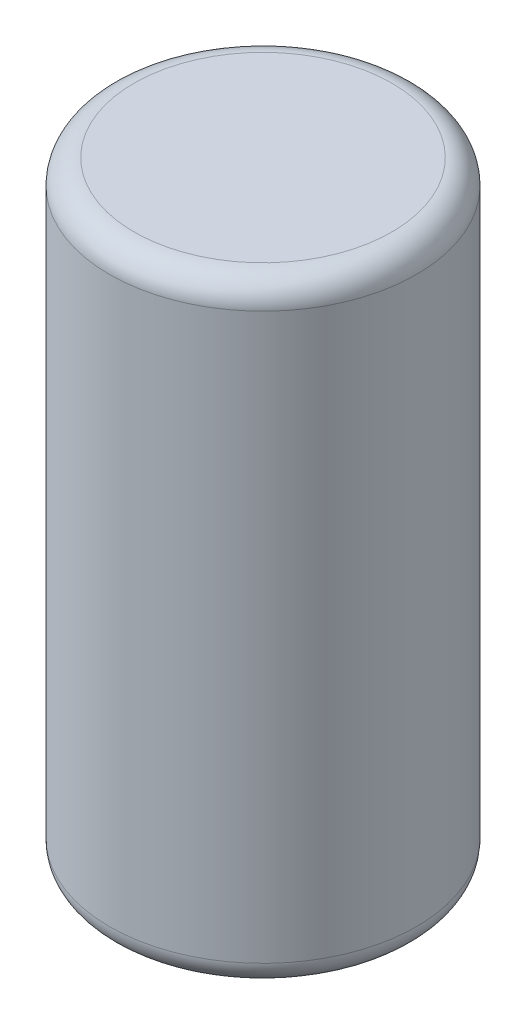
ISO-10303-21;
HEADER;
FILE_DESCRIPTION(('STEP AP214'),'2;1');
FILE_NAME('part.step','',(''),(''),'','','');
FILE_SCHEMA(('AUTOMOTIVE_DESIGN { 1 0 10303 214 1 1 1 1 }'));
ENDSEC;
DATA;
#1=APPLICATION_CONTEXT('core data for automotive mechanical design processes');
#2=APPLICATION_PROTOCOL_DEFINITION('international standard','automotive_design',2000,#1);
#3=PRODUCT_CONTEXT('',#1,'mechanical');
#4=PRODUCT('Part','Part','',(#3));
#5=PRODUCT_RELATED_PRODUCT_CATEGORY('part','',(#4));
#6=PRODUCT_DEFINITION_FORMATION('','',#4);
#7=PRODUCT_DEFINITION_CONTEXT('part definition',#1,'design');
#8=PRODUCT_DEFINITION('design','',#6,#7);
#9=PRODUCT_DEFINITION_SHAPE('','',#8);
#10=(LENGTH_UNIT() NAMED_UNIT(*) SI_UNIT(.MILLI.,.METRE.));
#11=(NAMED_UNIT(*) PLANE_ANGLE_UNIT() SI_UNIT($,.RADIAN.));
#12=(NAMED_UNIT(*) SI_UNIT($,.STERADIAN.) SOLID_ANGLE_UNIT());
#13=UNCERTAINTY_MEASURE_WITH_UNIT(LENGTH_MEASURE(1.E-05),#10,'distance_accuracy_value','');
#14=(GEOMETRIC_REPRESENTATION_CONTEXT(3) GLOBAL_UNCERTAINTY_ASSIGNED_CONTEXT((#13)) GLOBAL_UNIT_ASSIGNED_CONTEXT((#10,
#11,#12)) REPRESENTATION_CONTEXT('',''));
#15=CARTESIAN_POINT('',(0.,0.,0.));
#16=DIRECTION('',(0.,0.,1.));
#17=DIRECTION('',(1.,0.,0.));
#18=AXIS2_PLACEMENT_3D('',#15,#16,#17);
#19=CARTESIAN_POINT('',(0.,-3.175,0.));
#20=DIRECTION('',(0.,1.,0.));
#21=DIRECTION('',(0.,0.,1.));
#22=AXIS2_PLACEMENT_3D('',#19,#20,#21);
#23=PLANE('',#22);
#24=CARTESIAN_POINT('',(0.,-3.175,0.));
#25=DIRECTION('',(0.,1.,0.));
#26=DIRECTION('',(0.,0.,1.));
#27=AXIS2_PLACEMENT_3D('',#24,#25,#26);
#28=CIRCLE('',#27,1.3335);
#29=CARTESIAN_POINT('',(0.,-3.175,1.3335));
#30=VERTEX_POINT('',#29);
#31=EDGE_CURVE('E40',#30,#30,#28,.F.);
#32=ORIENTED_EDGE('',*,*,#31,.T.);
#33=EDGE_LOOP('',(#32));
#34=FACE_BOUND('',#33,.T.);
#35=ADVANCED_FACE('F33',(#34),#23,.F.);
#36=CARTESIAN_POINT('',(0.,4.25074013157895,0.));
#37=DIRECTION('',(0.,1.,0.));
#38=DIRECTION('',(0.,0.,1.));
#39=AXIS2_PLACEMENT_3D('',#36,#37,#38);
#40=CYLINDRICAL_SURFACE('',#39,1.5875);
#41=CARTESIAN_POINT('',(0.,-2.921,0.));
#42=DIRECTION('',(0.,1.,0.));
#43=DIRECTION('',(0.,0.,1.));
#44=AXIS2_PLACEMENT_3D('',#41,#42,#43);
#45=CIRCLE('',#44,1.5875);
#46=CARTESIAN_POINT('',(0.,-2.921,1.5875));
#47=VERTEX_POINT('',#46);
#48=EDGE_CURVE('E44',#47,#47,#45,.T.);
#49=ORIENTED_EDGE('',*,*,#48,.T.);
#50=EDGE_LOOP('',(#49));
#51=FACE_BOUND('',#50,.T.);
#52=CARTESIAN_POINT('',(0.,2.921,0.));
#53=DIRECTION('',(0.,-1.,0.));
#54=DIRECTION('',(0.,0.,-1.));
#55=AXIS2_PLACEMENT_3D('',#52,#53,#54);
#56=CIRCLE('',#55,1.5875);
#57=CARTESIAN_POINT('',(0.,2.921,-1.5875));
#58=VERTEX_POINT('',#57);
#59=EDGE_CURVE('E48',#58,#58,#56,.T.);
#60=ORIENTED_EDGE('',*,*,#59,.T.);
#61=EDGE_LOOP('',(#60));
#62=FACE_BOUND('',#61,.T.);
#63=ADVANCED_FACE('F54',(#51,#62),#40,.T.);
#64=CARTESIAN_POINT('',(0.,3.175,0.));
#65=DIRECTION('',(0.,-1.,0.));
#66=DIRECTION('',(0.,0.,-1.));
#67=AXIS2_PLACEMENT_3D('',#64,#65,#66);
#68=PLANE('',#67);
#69=CARTESIAN_POINT('',(0.,3.175,0.));
#70=DIRECTION('',(0.,-1.,0.));
#71=DIRECTION('',(0.,0.,-1.));
#72=AXIS2_PLACEMENT_3D('',#69,#70,#71);
#73=CIRCLE('',#72,1.3335);
#74=CARTESIAN_POINT('',(0.,3.175,-1.3335));
#75=VERTEX_POINT('',#74);
#76=EDGE_CURVE('E10',#75,#75,#73,.F.);
#77=ORIENTED_EDGE('',*,*,#76,.T.);
#78=EDGE_LOOP('',(#77));
#79=FACE_BOUND('',#78,.T.);
#80=ADVANCED_FACE('F62',(#79),#68,.F.);
#81=CARTESIAN_POINT('',(0.,-2.921,0.));
#82=DIRECTION('',(0.,1.,0.));
#83=DIRECTION('',(0.,0.,1.));
#84=AXIS2_PLACEMENT_3D('',#81,#82,#83);
#85=TOROIDAL_SURFACE('',#84,1.3335,0.254);
#86=ORIENTED_EDGE('',*,*,#31,.F.);
#87=EDGE_LOOP('',(#86));
#88=FACE_BOUND('',#87,.T.);
#89=ORIENTED_EDGE('',*,*,#48,.F.);
#90=EDGE_LOOP('',(#89));
#91=FACE_BOUND('',#90,.T.);
#92=ADVANCED_FACE('F58',(#88,#91),#85,.T.);
#93=CARTESIAN_POINT('',(0.,2.921,0.));
#94=DIRECTION('',(0.,-1.,0.));
#95=DIRECTION('',(0.,0.,-1.));
#96=AXIS2_PLACEMENT_3D('',#93,#94,#95);
#97=TOROIDAL_SURFACE('',#96,1.3335,0.254);
#98=ORIENTED_EDGE('',*,*,#59,.F.);
#99=EDGE_LOOP('',(#98));
#100=FACE_BOUND('',#99,.T.);
#101=ORIENTED_EDGE('',*,*,#76,.F.);
#102=EDGE_LOOP('',(#101));
#103=FACE_BOUND('',#102,.T.);
#104=ADVANCED_FACE('F35',(#100,#103),#97,.T.);
#105=CLOSED_SHELL('',(#35,#63,#80,#92,#104));
#106=MANIFOLD_SOLID_BREP('B2',#105);
#107=ADVANCED_BREP_SHAPE_REPRESENTATION('',(#18,#106),#14);
#108=SHAPE_DEFINITION_REPRESENTATION(#9,#107);
ENDSEC;
END-ISO-10303-21;
